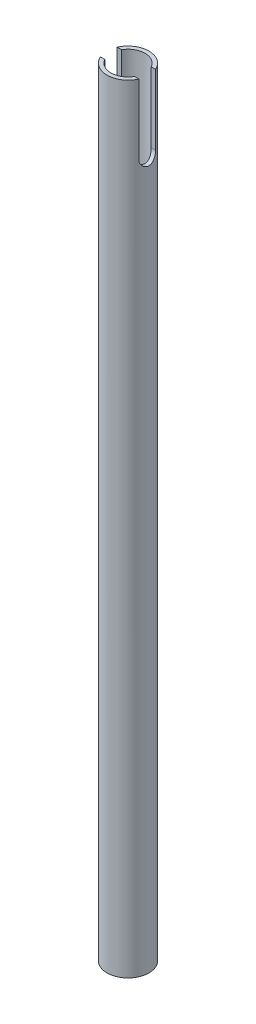
ISO-10303-21;
HEADER;
FILE_DESCRIPTION(('STEP AP214'),'2;1');
FILE_NAME('part.step','',(''),(''),'','','');
FILE_SCHEMA(('AUTOMOTIVE_DESIGN { 1 0 10303 214 1 1 1 1 }'));
ENDSEC;
DATA;
#1=APPLICATION_CONTEXT('core data for automotive mechanical design processes');
#2=APPLICATION_PROTOCOL_DEFINITION('international standard','automotive_design',2000,#1);
#3=PRODUCT_CONTEXT('',#1,'mechanical');
#4=PRODUCT('Part','Part','',(#3));
#5=PRODUCT_RELATED_PRODUCT_CATEGORY('part','',(#4));
#6=PRODUCT_DEFINITION_FORMATION('','',#4);
#7=PRODUCT_DEFINITION_CONTEXT('part definition',#1,'design');
#8=PRODUCT_DEFINITION('design','',#6,#7);
#9=PRODUCT_DEFINITION_SHAPE('','',#8);
#10=(LENGTH_UNIT() NAMED_UNIT(*) SI_UNIT(.MILLI.,.METRE.));
#11=(NAMED_UNIT(*) PLANE_ANGLE_UNIT() SI_UNIT($,.RADIAN.));
#12=(NAMED_UNIT(*) SI_UNIT($,.STERADIAN.) SOLID_ANGLE_UNIT());
#13=UNCERTAINTY_MEASURE_WITH_UNIT(LENGTH_MEASURE(1.E-05),#10,'distance_accuracy_value','');
#14=(GEOMETRIC_REPRESENTATION_CONTEXT(3) GLOBAL_UNCERTAINTY_ASSIGNED_CONTEXT((#13)) GLOBAL_UNIT_ASSIGNED_CONTEXT((#10,
#11,#12)) REPRESENTATION_CONTEXT('',''));
#15=CARTESIAN_POINT('',(0.,0.,0.));
#16=DIRECTION('',(0.,0.,1.));
#17=DIRECTION('',(1.,0.,0.));
#18=AXIS2_PLACEMENT_3D('',#15,#16,#17);
#19=CARTESIAN_POINT('',(-2.69334433135912E-13,294.838886827507,3.17500000000102));
#20=DIRECTION('',(0.,1.,0.));
#21=DIRECTION('',(-1.,0.,0.));
#22=AXIS2_PLACEMENT_3D('',#19,#20,#21);
#23=PLANE('',#22);
#24=DIRECTION('',(-1.,0.,0.));
#25=VECTOR('',#24,1.);
#26=CARTESIAN_POINT('',(-2.69334433135912E-13,294.838886827507,-3.17500000000002));
#27=LINE('',#26,#25);
#28=CARTESIAN_POINT('',(7.27483891574239,294.838886827507,-3.17500000000002));
#29=VERTEX_POINT('',#28);
#30=CARTESIAN_POINT('',(5.63085690548072,294.838886827507,-3.17500000000002));
#31=VERTEX_POINT('',#30);
#32=EDGE_CURVE('E172',#29,#31,#27,.T.);
#33=ORIENTED_EDGE('',*,*,#32,.F.);
#34=CARTESIAN_POINT('',(0.,294.838886827507,0.));
#35=DIRECTION('',(0.,1.,0.));
#36=DIRECTION('',(0.,0.,1.));
#37=AXIS2_PLACEMENT_3D('',#34,#35,#36);
#38=CIRCLE('',#37,7.9375);
#39=CARTESIAN_POINT('',(-7.27483891574239,294.838886827507,-3.17500000000002));
#40=VERTEX_POINT('',#39);
#41=EDGE_CURVE('E206',#29,#40,#38,.T.);
#42=ORIENTED_EDGE('',*,*,#41,.T.);
#43=CARTESIAN_POINT('',(-5.63085690548072,294.838886827507,-3.17500000000002));
#44=VERTEX_POINT('',#43);
#45=EDGE_CURVE('E173',#44,#40,#27,.T.);
#46=ORIENTED_EDGE('',*,*,#45,.F.);
#47=CARTESIAN_POINT('',(0.,294.838886827507,0.));
#48=DIRECTION('',(0.,1.,0.));
#49=DIRECTION('',(0.,0.,1.));
#50=AXIS2_PLACEMENT_3D('',#47,#48,#49);
#51=CIRCLE('',#50,6.4643);
#52=EDGE_CURVE('E209',#31,#44,#51,.T.);
#53=ORIENTED_EDGE('',*,*,#52,.F.);
#54=EDGE_LOOP('',(#33,#42,#46,#53));
#55=FACE_BOUND('',#54,.T.);
#56=ADVANCED_FACE('F38',(#55),#23,.T.);
#57=CARTESIAN_POINT('',(0.,342.689527130179,0.));
#58=DIRECTION('',(0.,-1.,0.));
#59=DIRECTION('',(0.,0.,-1.));
#60=AXIS2_PLACEMENT_3D('',#57,#58,#59);
#61=CYLINDRICAL_SURFACE('',#60,7.9375);
#62=CARTESIAN_POINT('',(0.,0.,0.));
#63=DIRECTION('',(0.,1.,0.));
#64=DIRECTION('',(0.,0.,1.));
#65=AXIS2_PLACEMENT_3D('',#62,#63,#64);
#66=CIRCLE('',#65,7.9375);
#67=CARTESIAN_POINT('',(0.,0.,7.9375));
#68=VERTEX_POINT('',#67);
#69=EDGE_CURVE('E210',#68,#68,#66,.T.);
#70=ORIENTED_EDGE('',*,*,#69,.T.);
#71=EDGE_LOOP('',(#70));
#72=FACE_BOUND('',#71,.T.);
#73=ORIENTED_EDGE('',*,*,#41,.F.);
#74=DIRECTION('',(0.,-1.,0.));
#75=VECTOR('',#74,1.);
#76=CARTESIAN_POINT('',(7.27483891574239,342.689527130179,-3.175));
#77=LINE('',#76,#75);
#78=CARTESIAN_POINT('',(7.27483891574238,268.283660055013,-3.17500000000003));
#79=VERTEX_POINT('',#78);
#80=EDGE_CURVE('E121',#29,#79,#77,.T.);
#81=ORIENTED_EDGE('',*,*,#80,.T.);
#82=CARTESIAN_POINT('',(7.27483891574239,268.283660055013,-3.17500000000002));
#83=CARTESIAN_POINT('',(7.2748213734673,268.198243264165,-3.17501266882703));
#84=CARTESIAN_POINT('',(7.27634285897749,268.11283606094,-3.17155340043566));
#85=CARTESIAN_POINT('',(7.28233280350349,267.942710619034,-3.15779000732848));
#86=CARTESIAN_POINT('',(7.28680014012065,267.857992130385,-3.1474884895671));
#87=CARTESIAN_POINT('',(7.29852780386515,267.690178225788,-3.12019320836238));
#88=CARTESIAN_POINT('',(7.30577708764083,267.607077740343,-3.10322589952439));
#89=CARTESIAN_POINT('',(7.32282084608482,267.442760079916,-3.06278962927676));
#90=CARTESIAN_POINT('',(7.3326154761132,267.361543020223,-3.03932027099636));
#91=CARTESIAN_POINT('',(7.36535374856867,267.121711892214,-2.95952817722214));
#92=CARTESIAN_POINT('',(7.39167700537415,266.966583963794,-2.89376627017735));
#93=CARTESIAN_POINT('',(7.45033388590046,266.66949707163,-2.7392025415261));
#94=CARTESIAN_POINT('',(7.48267321509131,266.527550802181,-2.65037881684983));
#95=CARTESIAN_POINT('',(7.55175336550834,266.252831000298,-2.44684289232141));
#96=CARTESIAN_POINT('',(7.588634899463,266.120902098173,-2.3310360096301));
#97=CARTESIAN_POINT('',(7.66147804996073,265.877739872857,-2.07914313305182));
#98=CARTESIAN_POINT('',(7.69743947634238,265.766510798434,-1.94305298619929));
#99=CARTESIAN_POINT('',(7.76610424655586,265.56362740431,-1.6478343790749));
#100=CARTESIAN_POINT('',(7.79862271461642,265.472920170623,-1.48800809365193));
#101=CARTESIAN_POINT('',(7.85501261299655,265.320045089307,-1.15383332747065));
#102=CARTESIAN_POINT('',(7.8788876513092,265.257865330661,-0.979490943577514));
#103=CARTESIAN_POINT('',(7.91429574508624,265.166855899045,-0.630185812820646));
#104=CARTESIAN_POINT('',(7.92637039529115,265.136557274511,-0.455661798193268));
#105=CARTESIAN_POINT('',(7.93877492459936,265.10543983904,-0.103613634211568));
#106=CARTESIAN_POINT('',(7.93910896442721,265.104610584527,0.0739094300030535));
#107=CARTESIAN_POINT('',(7.92832361516669,265.131651576453,0.416295487790174));
#108=CARTESIAN_POINT('',(7.91784651916131,265.157912368482,0.581309494992117));
#109=CARTESIAN_POINT('',(7.88748217026596,265.235649568583,0.90435871255695));
#110=CARTESIAN_POINT('',(7.86759438481231,265.287127403726,1.06239352740442));
#111=CARTESIAN_POINT('',(7.81997467816328,265.414470371741,1.36984988491621));
#112=CARTESIAN_POINT('',(7.7921290207194,265.490691461876,1.51910565802054));
#113=CARTESIAN_POINT('',(7.7313568354174,265.665021852072,1.80309420082014));
#114=CARTESIAN_POINT('',(7.69842852631223,265.763138831079,1.9378218508183));
#115=CARTESIAN_POINT('',(7.62828318752465,265.985985625325,2.19831250886752));
#116=CARTESIAN_POINT('',(7.59092651959626,266.1120387678,2.32290812422052));
#117=CARTESIAN_POINT('',(7.51779639956165,266.383379666392,2.54968017957911));
#118=CARTESIAN_POINT('',(7.48202367463434,266.528676137309,2.6518464058569));
#119=CARTESIAN_POINT('',(7.41514238501918,266.839825077047,2.83359604410577));
#120=CARTESIAN_POINT('',(7.38419755733311,267.006148568512,2.9124454400729));
#121=CARTESIAN_POINT('',(7.34535742834898,267.264689441899,3.00845526999255));
#122=CARTESIAN_POINT('',(7.33367552004289,267.352356250122,3.03674359852998));
#123=CARTESIAN_POINT('',(7.31322917691504,267.530121964836,3.08565852812916));
#124=CARTESIAN_POINT('',(7.30446343423192,267.620219761407,3.10628856431505));
#125=CARTESIAN_POINT('',(7.28994070197193,267.805384213444,3.14023004946565));
#126=CARTESIAN_POINT('',(7.2843027635288,267.900513238969,3.15325280299648));
#127=CARTESIAN_POINT('',(7.27673901487912,268.09164381356,3.17064531592314));
#128=CARTESIAN_POINT('',(7.2748109173123,268.1876447883,3.17502040721544));
#129=CARTESIAN_POINT('',(7.2748389157424,268.283660055013,3.175));
#130=B_SPLINE_CURVE_WITH_KNOTS('',3,(#82,#83,#84,#85,#86,#87,#88,#89,#90,#91,#92,#93,#94,#95,
#96,#97,#98,#99,#100,#101,#102,#103,#104,#105,#106,#107,#108,#109,#110,#111,#112,#113,#114,#115,
#116,#117,#118,#119,#120,#121,#122,#123,#124,#125,#126,#127,#128,#129),.UNSPECIFIED.,.F.,.F.,(4,
2,2,2,2,2,2,2,2,2,2,2,2,2,2,2,2,2,2,2,2,2,2,4),(0.,0.256150829294331,0.512204118914609,
0.767251309112382,1.02231407025902,1.53143426526081,2.04103977971416,2.57679901192851,
3.11266809105967,3.66971038544649,4.22651988700747,4.75637028950527,5.28603291779514,
5.7859440297451,6.28588343572725,6.79335980872479,7.30101443548666,7.84196226045962,
8.38315590960402,8.93991483457341,9.21815697205887,9.49627415290113,9.78435582473148,
10.072259818324),.UNSPECIFIED.);
#131=CARTESIAN_POINT('',(7.27483891574239,268.283660055013,3.175));
#132=VERTEX_POINT('',#131);
#133=EDGE_CURVE('E120',#79,#132,#130,.T.);
#134=ORIENTED_EDGE('',*,*,#133,.T.);
#135=DIRECTION('',(0.,-1.,0.));
#136=VECTOR('',#135,1.);
#137=CARTESIAN_POINT('',(7.27483891574239,342.689527130179,3.17500000000001));
#138=LINE('',#137,#136);
#139=CARTESIAN_POINT('',(7.27483891574195,294.838886827507,3.17500000000102));
#140=VERTEX_POINT('',#139);
#141=EDGE_CURVE('E138',#132,#140,#138,.F.);
#142=ORIENTED_EDGE('',*,*,#141,.T.);
#143=CARTESIAN_POINT('',(-7.27483891574195,294.838886827507,3.17500000000102));
#144=VERTEX_POINT('',#143);
#145=EDGE_CURVE('E133',#144,#140,#38,.T.);
#146=ORIENTED_EDGE('',*,*,#145,.F.);
#147=DIRECTION('',(0.,-1.,0.));
#148=VECTOR('',#147,1.);
#149=CARTESIAN_POINT('',(-7.27483891574239,342.689527130179,3.17500000000001));
#150=LINE('',#149,#148);
#151=CARTESIAN_POINT('',(-7.27483891574239,268.283660055013,3.175));
#152=VERTEX_POINT('',#151);
#153=EDGE_CURVE('E60',#144,#152,#150,.T.);
#154=ORIENTED_EDGE('',*,*,#153,.T.);
#155=CARTESIAN_POINT('',(-7.2748389157424,268.283660055013,3.175));
#156=CARTESIAN_POINT('',(-7.27482137346731,268.198243264165,3.17501266882701));
#157=CARTESIAN_POINT('',(-7.2763428589775,268.11283606094,3.17155340043565));
#158=CARTESIAN_POINT('',(-7.2823328035035,267.942710619034,3.15779000732847));
#159=CARTESIAN_POINT('',(-7.28680014012065,267.857992130385,3.14748848956708));
#160=CARTESIAN_POINT('',(-7.29852780386515,267.690178225788,3.12019320836236));
#161=CARTESIAN_POINT('',(-7.30577708764083,267.607077740343,3.10322589952438));
#162=CARTESIAN_POINT('',(-7.32282084608483,267.442760079916,3.06278962927674));
#163=CARTESIAN_POINT('',(-7.3326154761132,267.361543020223,3.03932027099634));
#164=CARTESIAN_POINT('',(-7.36535374856868,267.121711892214,2.95952817722212));
#165=CARTESIAN_POINT('',(-7.39167700537416,266.966583963794,2.89376627017733));
#166=CARTESIAN_POINT('',(-7.45033388590046,266.66949707163,2.73920254152609));
#167=CARTESIAN_POINT('',(-7.48267321509131,266.527550802181,2.65037881684981));
#168=CARTESIAN_POINT('',(-7.55175336550835,266.252831000298,2.4468428923214));
#169=CARTESIAN_POINT('',(-7.588634899463,266.120902098173,2.33103600963009));
#170=CARTESIAN_POINT('',(-7.66147804996073,265.877739872857,2.07914313305181));
#171=CARTESIAN_POINT('',(-7.69743947634239,265.766510798434,1.94305298619927));
#172=CARTESIAN_POINT('',(-7.76610424655586,265.56362740431,1.64783437907488));
#173=CARTESIAN_POINT('',(-7.79862271461643,265.472920170623,1.48800809365192));
#174=CARTESIAN_POINT('',(-7.85501261299655,265.320045089307,1.15383332747063));
#175=CARTESIAN_POINT('',(-7.87888765130921,265.257865330661,0.979490943577496));
#176=CARTESIAN_POINT('',(-7.91429574508624,265.166855899045,0.630185812820627));
#177=CARTESIAN_POINT('',(-7.92637039529115,265.136557274511,0.455661798193249));
#178=CARTESIAN_POINT('',(-7.93877492459936,265.10543983904,0.103613634211549));
#179=CARTESIAN_POINT('',(-7.93910896442721,265.104610584527,-0.0739094300030727));
#180=CARTESIAN_POINT('',(-7.92832361516669,265.131651576453,-0.416295487790193));
#181=CARTESIAN_POINT('',(-7.91784651916131,265.157912368482,-0.581309494992136));
#182=CARTESIAN_POINT('',(-7.88748217026596,265.235649568583,-0.904358712556969));
#183=CARTESIAN_POINT('',(-7.86759438481231,265.287127403726,-1.06239352740444));
#184=CARTESIAN_POINT('',(-7.81997467816327,265.414470371741,-1.36984988491622));
#185=CARTESIAN_POINT('',(-7.79212902071939,265.490691461876,-1.51910565802056));
#186=CARTESIAN_POINT('',(-7.73135683541739,265.665021852072,-1.80309420082016));
#187=CARTESIAN_POINT('',(-7.69842852631223,265.763138831079,-1.93782185081832));
#188=CARTESIAN_POINT('',(-7.62828318752464,265.985985625325,-2.19831250886754));
#189=CARTESIAN_POINT('',(-7.59092651959626,266.1120387678,-2.32290812422054));
#190=CARTESIAN_POINT('',(-7.51779639956165,266.383379666392,-2.54968017957913));
#191=CARTESIAN_POINT('',(-7.48202367463433,266.528676137309,-2.65184640585692));
#192=CARTESIAN_POINT('',(-7.41514238501917,266.839825077047,-2.83359604410579));
#193=CARTESIAN_POINT('',(-7.3841975573331,267.006148568512,-2.91244544007292));
#194=CARTESIAN_POINT('',(-7.34535742834897,267.264689441899,-3.00845526999257));
#195=CARTESIAN_POINT('',(-7.33367552004289,267.352356250122,-3.03674359853));
#196=CARTESIAN_POINT('',(-7.31322917691503,267.530121964836,-3.08565852812917));
#197=CARTESIAN_POINT('',(-7.30446343423191,267.620219761407,-3.10628856431507));
#198=CARTESIAN_POINT('',(-7.28994070197192,267.805384213444,-3.14023004946566));
#199=CARTESIAN_POINT('',(-7.28430276352879,267.900513238969,-3.15325280299649));
#200=CARTESIAN_POINT('',(-7.27673901487911,268.09164381356,-3.17064531592316));
#201=CARTESIAN_POINT('',(-7.27481091731229,268.1876447883,-3.17502040721546));
#202=CARTESIAN_POINT('',(-7.27483891574239,268.283660055013,-3.17500000000002));
#203=B_SPLINE_CURVE_WITH_KNOTS('',3,(#155,#156,#157,#158,#159,#160,#161,#162,#163,#164,#165,
#166,#167,#168,#169,#170,#171,#172,#173,#174,#175,#176,#177,#178,#179,#180,#181,#182,#183,#184,
#185,#186,#187,#188,#189,#190,#191,#192,#193,#194,#195,#196,#197,#198,#199,#200,#201,#202),
.UNSPECIFIED.,.F.,.F.,(4,2,2,2,2,2,2,2,2,2,2,2,2,2,2,2,2,2,2,2,2,2,2,4),(0.,0.256150829294331,
0.512204118914608,0.767251309112382,1.02231407025902,1.53143426526081,2.04103977971416,
2.57679901192851,3.11266809105967,3.66971038544649,4.22651988700747,4.75637028950527,
5.28603291779514,5.7859440297451,6.28588343572725,6.79335980872479,7.30101443548666,
7.84196226045962,8.38315590960402,8.93991483457341,9.21815697205887,9.49627415290113,
9.78435582473148,10.072259818324),.UNSPECIFIED.);
#204=CARTESIAN_POINT('',(-7.27483891574238,268.283660055013,-3.17500000000003));
#205=VERTEX_POINT('',#204);
#206=EDGE_CURVE('E111',#152,#205,#203,.T.);
#207=ORIENTED_EDGE('',*,*,#206,.T.);
#208=DIRECTION('',(0.,-1.,0.));
#209=VECTOR('',#208,1.);
#210=CARTESIAN_POINT('',(-7.27483891574239,342.689527130179,-3.175));
#211=LINE('',#210,#209);
#212=EDGE_CURVE('E136',#205,#40,#211,.F.);
#213=ORIENTED_EDGE('',*,*,#212,.T.);
#214=EDGE_LOOP('',(#73,#81,#134,#142,#146,#154,#207,#213));
#215=FACE_BOUND('',#214,.T.);
#216=ADVANCED_FACE('F40',(#72,#215),#61,.T.);
#217=CARTESIAN_POINT('',(0.,0.,0.));
#218=DIRECTION('',(0.,1.,0.));
#219=DIRECTION('',(0.,0.,1.));
#220=AXIS2_PLACEMENT_3D('',#217,#218,#219);
#221=PLANE('',#220);
#222=ORIENTED_EDGE('',*,*,#69,.F.);
#223=EDGE_LOOP('',(#222));
#224=FACE_BOUND('',#223,.T.);
#225=CARTESIAN_POINT('',(0.,0.,0.));
#226=DIRECTION('',(0.,1.,0.));
#227=DIRECTION('',(0.,0.,1.));
#228=AXIS2_PLACEMENT_3D('',#225,#226,#227);
#229=CIRCLE('',#228,6.4643);
#230=CARTESIAN_POINT('',(0.,0.,6.4643));
#231=VERTEX_POINT('',#230);
#232=EDGE_CURVE('E214',#231,#231,#229,.T.);
#233=ORIENTED_EDGE('',*,*,#232,.T.);
#234=EDGE_LOOP('',(#233));
#235=FACE_BOUND('',#234,.T.);
#236=ADVANCED_FACE('F179',(#224,#235),#221,.F.);
#237=CARTESIAN_POINT('',(0.,342.689527130179,0.));
#238=DIRECTION('',(0.,-1.,0.));
#239=DIRECTION('',(0.,0.,-1.));
#240=AXIS2_PLACEMENT_3D('',#237,#238,#239);
#241=CYLINDRICAL_SURFACE('',#240,6.4643);
#242=DIRECTION('',(0.,-1.,0.));
#243=VECTOR('',#242,1.);
#244=CARTESIAN_POINT('',(-5.63085690548073,342.689527130179,-3.175));
#245=LINE('',#244,#243);
#246=CARTESIAN_POINT('',(-5.63085690548071,268.283660055013,-3.17500000000003));
#247=VERTEX_POINT('',#246);
#248=EDGE_CURVE('E134',#247,#44,#245,.F.);
#249=ORIENTED_EDGE('',*,*,#248,.F.);
#250=CARTESIAN_POINT('',(-5.63085690548073,268.283660055013,3.175));
#251=CARTESIAN_POINT('',(-5.63083314427865,268.200286710382,3.17501475658537));
#252=CARTESIAN_POINT('',(-5.63270800290612,268.11692652629,3.17171650894932));
#253=CARTESIAN_POINT('',(-5.64007619078876,267.95092826617,3.15861005673362));
#254=CARTESIAN_POINT('',(-5.64556738634361,267.868289793435,3.14880569084843));
#255=CARTESIAN_POINT('',(-5.65994981136478,267.704786304415,3.12287502503968));
#256=CARTESIAN_POINT('',(-5.66882198481542,267.623913986792,3.10678414485082));
#257=CARTESIAN_POINT('',(-5.68964152520503,267.464049730009,3.06848950606602));
#258=CARTESIAN_POINT('',(-5.70158922758274,267.385057996985,3.0462850806656));
#259=CARTESIAN_POINT('',(-5.74141923049072,267.151993198754,2.97094683956398));
#260=CARTESIAN_POINT('',(-5.77333408209964,267.001353569371,2.9090108202004));
#261=CARTESIAN_POINT('',(-5.84425924105452,266.712499000312,2.76375069900003));
#262=CARTESIAN_POINT('',(-5.8832801090714,266.574303016919,2.68039468681891));
#263=CARTESIAN_POINT('',(-5.96775511660967,266.302362239444,2.48697633404427));
#264=CARTESIAN_POINT('',(-6.01347388807209,266.16982520491,2.37532770540394));
#265=CARTESIAN_POINT('',(-6.10404750316968,265.924450447699,2.13181920715588));
#266=CARTESIAN_POINT('',(-6.14890211569321,265.8116179315,1.99995401300489));
#267=CARTESIAN_POINT('',(-6.23617179606459,265.601684855218,1.70932187954948));
#268=CARTESIAN_POINT('',(-6.27824209999685,265.506071388216,1.54936740140355));
#269=CARTESIAN_POINT('',(-6.35176072116116,265.343664156158,1.21319061658811));
#270=CARTESIAN_POINT('',(-6.38321544776104,265.276852994348,1.03697820811136));
#271=CARTESIAN_POINT('',(-6.43004158193837,265.178726948965,0.686188092188344));
#272=CARTESIAN_POINT('',(-6.4463738522475,265.145278964049,0.512338218857001));
#273=CARTESIAN_POINT('',(-6.46469144763397,265.107818375536,0.160782019690497));
#274=CARTESIAN_POINT('',(-6.46668486855406,265.103789161817,-0.0169220731568769));
#275=CARTESIAN_POINT('',(-6.45656772214049,265.124424959705,-0.355165464690641));
#276=CARTESIAN_POINT('',(-6.44562758639317,265.14670857049,-0.515892945153662));
#277=CARTESIAN_POINT('',(-6.41262380355029,265.21509537683,-0.830980900255626));
#278=CARTESIAN_POINT('',(-6.39055953953696,265.261199893438,-0.985341021262245));
#279=CARTESIAN_POINT('',(-6.33694807701977,265.376259136466,-1.28605792480315));
#280=CARTESIAN_POINT('',(-6.30527071175889,265.4455289375,-1.4322699933214));
#281=CARTESIAN_POINT('',(-6.23531544865734,265.604536123304,-1.71135796541494));
#282=CARTESIAN_POINT('',(-6.19703506227319,265.694281228927,-1.84422881097801));
#283=CARTESIAN_POINT('',(-6.11334024943196,265.901197126011,-2.10589815284401));
#284=CARTESIAN_POINT('',(-6.06759349912715,266.020131162232,-2.23319819913489));
#285=CARTESIAN_POINT('',(-5.97642079952693,266.277284673666,-2.4668462243058));
#286=CARTESIAN_POINT('',(-5.93099515323758,266.415520324906,-2.57317644688654));
#287=CARTESIAN_POINT('',(-5.84266284464015,266.717723152423,-2.76814528378425));
#288=CARTESIAN_POINT('',(-5.80007313328348,266.882739171476,-2.85533090866607));
#289=CARTESIAN_POINT('',(-5.74498523796175,267.141115989921,-2.96377401450741));
#290=CARTESIAN_POINT('',(-5.72809486991882,267.22900447788,-2.99618869442099));
#291=CARTESIAN_POINT('',(-5.6978812208207,267.407841164464,-3.05325494421093));
#292=CARTESIAN_POINT('',(-5.68455638707003,267.498788011769,-3.07790989407048));
#293=CARTESIAN_POINT('',(-5.65951648210792,267.703905447753,-3.12376274190013));
#294=CARTESIAN_POINT('',(-5.64884707083826,267.818676413049,-3.14291763203009));
#295=CARTESIAN_POINT('',(-5.63809564796982,267.99222951956,-3.1621351306962));
#296=CARTESIAN_POINT('',(-5.63538722073202,268.050369392927,-3.16695519983113));
#297=CARTESIAN_POINT('',(-5.63176603795251,268.166887024159,-3.1733882775212));
#298=CARTESIAN_POINT('',(-5.6308534434139,268.225264802883,-3.17500099852575));
#299=CARTESIAN_POINT('',(-5.63085690548072,268.283660055013,-3.17500000000002));
#300=B_SPLINE_CURVE_WITH_KNOTS('',3,(#250,#251,#252,#253,#254,#255,#256,#257,#258,#259,#260,
#261,#262,#263,#264,#265,#266,#267,#268,#269,#270,#271,#272,#273,#274,#275,#276,#277,#278,#279,
#280,#281,#282,#283,#284,#285,#286,#287,#288,#289,#290,#291,#292,#293,#294,#295,#296,#297,#298,
#299),.UNSPECIFIED.,.F.,.F.,(4,2,2,2,2,2,2,2,2,2,2,2,2,2,2,2,2,2,2,2,2,2,2,2,4),(0.,
0.250012145988229,0.499876912554615,0.74835372511285,0.996857649784888,1.4924278441344,
1.98874063593385,2.52414179614758,3.05968421079775,3.62982161542685,4.19961416973237,
4.73004882970633,5.26018397799675,5.74579693142526,6.23143681875925,6.72397049630929,
7.21669020692482,7.75472587709897,8.2932151937208,8.86416763704416,9.14936329782662,
9.43443456060703,9.78397951274087,9.95908597830925,10.1342081421097),.UNSPECIFIED.);
#301=CARTESIAN_POINT('',(-5.63085690548072,268.283660055013,3.175));
#302=VERTEX_POINT('',#301);
#303=EDGE_CURVE('E12',#302,#247,#300,.T.);
#304=ORIENTED_EDGE('',*,*,#303,.F.);
#305=DIRECTION('',(0.,-1.,0.));
#306=VECTOR('',#305,1.);
#307=CARTESIAN_POINT('',(-5.63085690548072,342.689527130179,3.17500000000001));
#308=LINE('',#307,#306);
#309=CARTESIAN_POINT('',(-5.63085690548015,294.838886827507,3.17500000000102));
#310=VERTEX_POINT('',#309);
#311=EDGE_CURVE('E125',#310,#302,#308,.T.);
#312=ORIENTED_EDGE('',*,*,#311,.F.);
#313=CARTESIAN_POINT('',(5.63085690548015,294.838886827507,3.17500000000102));
#314=VERTEX_POINT('',#313);
#315=EDGE_CURVE('E204',#310,#314,#51,.T.);
#316=ORIENTED_EDGE('',*,*,#315,.T.);
#317=DIRECTION('',(0.,-1.,0.));
#318=VECTOR('',#317,1.);
#319=CARTESIAN_POINT('',(5.63085690548072,342.689527130179,3.17500000000001));
#320=LINE('',#319,#318);
#321=CARTESIAN_POINT('',(5.63085690548072,268.283660055013,3.175));
#322=VERTEX_POINT('',#321);
#323=EDGE_CURVE('E68',#322,#314,#320,.F.);
#324=ORIENTED_EDGE('',*,*,#323,.F.);
#325=CARTESIAN_POINT('',(5.63085690548072,268.283660055013,-3.17500000000002));
#326=CARTESIAN_POINT('',(5.63083314427864,268.200286710382,-3.17501475658539));
#327=CARTESIAN_POINT('',(5.63270800290611,268.11692652629,-3.17171650894934));
#328=CARTESIAN_POINT('',(5.64007619078875,267.95092826617,-3.15861005673364));
#329=CARTESIAN_POINT('',(5.6455673863436,267.868289793435,-3.14880569084844));
#330=CARTESIAN_POINT('',(5.65994981136478,267.704786304415,-3.1228750250397));
#331=CARTESIAN_POINT('',(5.66882198481541,267.623913986792,-3.10678414485084));
#332=CARTESIAN_POINT('',(5.68964152520502,267.464049730009,-3.06848950606604));
#333=CARTESIAN_POINT('',(5.70158922758273,267.385057996985,-3.04628508066561));
#334=CARTESIAN_POINT('',(5.74141923049071,267.151993198754,-2.970946839564));
#335=CARTESIAN_POINT('',(5.77333408209963,267.001353569371,-2.90901082020042));
#336=CARTESIAN_POINT('',(5.84425924105451,266.712499000312,-2.76375069900005));
#337=CARTESIAN_POINT('',(5.88328010907139,266.574303016919,-2.68039468681893));
#338=CARTESIAN_POINT('',(5.96775511660966,266.302362239444,-2.48697633404429));
#339=CARTESIAN_POINT('',(6.01347388807209,266.16982520491,-2.37532770540395));
#340=CARTESIAN_POINT('',(6.10404750316967,265.924450447699,-2.13181920715591));
#341=CARTESIAN_POINT('',(6.1489021156932,265.8116179315,-1.99995401300494));
#342=CARTESIAN_POINT('',(6.23617179606457,265.601684855218,-1.70932187954955));
#343=CARTESIAN_POINT('',(6.27824209999683,265.506071388216,-1.54936740140363));
#344=CARTESIAN_POINT('',(6.35176072116115,265.343664156158,-1.21319061658817));
#345=CARTESIAN_POINT('',(6.38321544776103,265.276852994348,-1.0369782081114));
#346=CARTESIAN_POINT('',(6.43004158193837,265.178726948965,-0.68618809218836));
#347=CARTESIAN_POINT('',(6.4463738522475,265.145278964049,-0.512338218857017));
#348=CARTESIAN_POINT('',(6.46469144763397,265.107818375536,-0.16078201969051));
#349=CARTESIAN_POINT('',(6.46668486855406,265.103789161817,0.0169220731568666));
#350=CARTESIAN_POINT('',(6.45656772214049,265.124424959705,0.355165464690633));
#351=CARTESIAN_POINT('',(6.44562758639317,265.14670857049,0.515892945153654));
#352=CARTESIAN_POINT('',(6.41262380355029,265.21509537683,0.830980900255617));
#353=CARTESIAN_POINT('',(6.39055953953696,265.261199893438,0.985341021262237));
#354=CARTESIAN_POINT('',(6.33694807701977,265.376259136466,1.28605792480314));
#355=CARTESIAN_POINT('',(6.30527071175889,265.4455289375,1.43226999332139));
#356=CARTESIAN_POINT('',(6.23531544865734,265.604536123304,1.71135796541493));
#357=CARTESIAN_POINT('',(6.19703506227319,265.694281228927,1.844228810978));
#358=CARTESIAN_POINT('',(6.11334024943196,265.901197126011,2.10589815284401));
#359=CARTESIAN_POINT('',(6.06759349912715,266.020131162232,2.23319819913489));
#360=CARTESIAN_POINT('',(5.97642079952693,266.277284673666,2.46684622430579));
#361=CARTESIAN_POINT('',(5.93099515323759,266.415520324906,2.57317644688652));
#362=CARTESIAN_POINT('',(5.84266284464016,266.717723152423,2.76814528378423));
#363=CARTESIAN_POINT('',(5.80007313328349,266.882739171476,2.85533090866605));
#364=CARTESIAN_POINT('',(5.74498523796176,267.141115989921,2.96377401450739));
#365=CARTESIAN_POINT('',(5.72809486991883,267.22900447788,2.99618869442096));
#366=CARTESIAN_POINT('',(5.69788122082071,267.407841164464,3.0532549442109));
#367=CARTESIAN_POINT('',(5.68455638707004,267.498788011769,3.07790989407046));
#368=CARTESIAN_POINT('',(5.65951648210793,267.703905447753,3.12376274190011));
#369=CARTESIAN_POINT('',(5.64884707083827,267.818676413049,3.14291763203007));
#370=CARTESIAN_POINT('',(5.63809564796983,267.99222951956,3.16213513069618));
#371=CARTESIAN_POINT('',(5.63538722073203,268.050369392927,3.16695519983111));
#372=CARTESIAN_POINT('',(5.63176603795252,268.166887024159,3.17338827752118));
#373=CARTESIAN_POINT('',(5.63085344341391,268.225264802883,3.17500099852574));
#374=CARTESIAN_POINT('',(5.63085690548073,268.283660055013,3.175));
#375=B_SPLINE_CURVE_WITH_KNOTS('',3,(#325,#326,#327,#328,#329,#330,#331,#332,#333,#334,#335,
#336,#337,#338,#339,#340,#341,#342,#343,#344,#345,#346,#347,#348,#349,#350,#351,#352,#353,#354,
#355,#356,#357,#358,#359,#360,#361,#362,#363,#364,#365,#366,#367,#368,#369,#370,#371,#372,#373,
#374),.UNSPECIFIED.,.F.,.F.,(4,2,2,2,2,2,2,2,2,2,2,2,2,2,2,2,2,2,2,2,2,2,2,2,4),(0.,
0.250012145988229,0.499876912554615,0.74835372511285,0.996857649784888,1.4924278441344,
1.98874063593385,2.52414179614754,3.05968421079767,3.6298216154268,4.19961416973237,
4.73004882970633,5.26018397799675,5.74579693142527,6.23143681875926,6.7239704963093,
7.21669020692483,7.75472587709898,8.29321519372081,8.86416763704417,9.14936329782656,
9.43443456060704,9.78397951274087,9.95908597830926,10.1342081421097),.UNSPECIFIED.);
#376=CARTESIAN_POINT('',(5.63085690548071,268.283660055013,-3.17500000000003));
#377=VERTEX_POINT('',#376);
#378=EDGE_CURVE('E53',#377,#322,#375,.T.);
#379=ORIENTED_EDGE('',*,*,#378,.F.);
#380=DIRECTION('',(0.,-1.,0.));
#381=VECTOR('',#380,1.);
#382=CARTESIAN_POINT('',(5.63085690548073,342.689527130179,-3.175));
#383=LINE('',#382,#381);
#384=EDGE_CURVE('E143',#31,#377,#383,.T.);
#385=ORIENTED_EDGE('',*,*,#384,.F.);
#386=ORIENTED_EDGE('',*,*,#52,.T.);
#387=EDGE_LOOP('',(#249,#304,#312,#316,#324,#379,#385,#386));
#388=FACE_BOUND('',#387,.T.);
#389=ORIENTED_EDGE('',*,*,#232,.F.);
#390=EDGE_LOOP('',(#389));
#391=FACE_BOUND('',#390,.T.);
#392=ADVANCED_FACE('F175',(#388,#391),#241,.F.);
#393=DIRECTION('',(1.,0.,0.));
#394=VECTOR('',#393,1.);
#395=CARTESIAN_POINT('',(-2.69334433135912E-13,294.838886827507,3.17500000000102));
#396=LINE('',#395,#394);
#397=EDGE_CURVE('E202',#144,#310,#396,.T.);
#398=ORIENTED_EDGE('',*,*,#397,.F.);
#399=ORIENTED_EDGE('',*,*,#145,.T.);
#400=EDGE_CURVE('E205',#314,#140,#396,.T.);
#401=ORIENTED_EDGE('',*,*,#400,.F.);
#402=ORIENTED_EDGE('',*,*,#315,.F.);
#403=EDGE_LOOP('',(#398,#399,#401,#402));
#404=FACE_BOUND('',#403,.T.);
#405=ADVANCED_FACE('F178',(#404),#23,.T.);
#406=CARTESIAN_POINT('',(-7.9375,319.083660055013,3.17500000000001));
#407=DIRECTION('',(0.,0.,1.));
#408=DIRECTION('',(0.,-1.,0.));
#409=AXIS2_PLACEMENT_3D('',#406,#407,#408);
#410=PLANE('',#409);
#411=DIRECTION('',(1.,0.,0.));
#412=VECTOR('',#411,1.);
#413=CARTESIAN_POINT('',(-7.9375,268.283660055013,3.175));
#414=LINE('',#413,#412);
#415=EDGE_CURVE('E127',#322,#132,#414,.T.);
#416=ORIENTED_EDGE('',*,*,#415,.F.);
#417=ORIENTED_EDGE('',*,*,#323,.T.);
#418=ORIENTED_EDGE('',*,*,#400,.T.);
#419=ORIENTED_EDGE('',*,*,#141,.F.);
#420=EDGE_LOOP('',(#416,#417,#418,#419));
#421=FACE_BOUND('',#420,.T.);
#422=ADVANCED_FACE('F196',(#421),#410,.F.);
#423=CARTESIAN_POINT('',(-7.9375,319.083660055013,-3.17500000000001));
#424=DIRECTION('',(0.,0.,-1.));
#425=DIRECTION('',(0.,1.,0.));
#426=AXIS2_PLACEMENT_3D('',#423,#424,#425);
#427=PLANE('',#426);
#428=ORIENTED_EDGE('',*,*,#32,.T.);
#429=ORIENTED_EDGE('',*,*,#384,.T.);
#430=DIRECTION('',(1.,0.,0.));
#431=VECTOR('',#430,1.);
#432=CARTESIAN_POINT('',(-7.9375,268.283660055013,-3.17500000000003));
#433=LINE('',#432,#431);
#434=EDGE_CURVE('E126',#377,#79,#433,.T.);
#435=ORIENTED_EDGE('',*,*,#434,.T.);
#436=ORIENTED_EDGE('',*,*,#80,.F.);
#437=EDGE_LOOP('',(#428,#429,#435,#436));
#438=FACE_BOUND('',#437,.T.);
#439=ADVANCED_FACE('F161',(#438),#427,.F.);
#440=CARTESIAN_POINT('',(-7.9375,268.283660055013,0.));
#441=DIRECTION('',(1.,0.,0.));
#442=DIRECTION('',(0.,0.,-1.));
#443=AXIS2_PLACEMENT_3D('',#440,#441,#442);
#444=CYLINDRICAL_SURFACE('',#443,3.17500000000001);
#445=ORIENTED_EDGE('',*,*,#434,.F.);
#446=ORIENTED_EDGE('',*,*,#378,.T.);
#447=ORIENTED_EDGE('',*,*,#415,.T.);
#448=ORIENTED_EDGE('',*,*,#133,.F.);
#449=EDGE_LOOP('',(#445,#446,#447,#448));
#450=FACE_BOUND('',#449,.T.);
#451=ADVANCED_FACE('F156',(#450),#444,.F.);
#452=EDGE_CURVE('E113',#152,#302,#414,.T.);
#453=ORIENTED_EDGE('',*,*,#452,.T.);
#454=ORIENTED_EDGE('',*,*,#303,.T.);
#455=EDGE_CURVE('E116',#205,#247,#433,.T.);
#456=ORIENTED_EDGE('',*,*,#455,.F.);
#457=ORIENTED_EDGE('',*,*,#206,.F.);
#458=EDGE_LOOP('',(#453,#454,#456,#457));
#459=FACE_BOUND('',#458,.T.);
#460=ADVANCED_FACE('F112',(#459),#444,.F.);
#461=ORIENTED_EDGE('',*,*,#455,.T.);
#462=ORIENTED_EDGE('',*,*,#248,.T.);
#463=ORIENTED_EDGE('',*,*,#45,.T.);
#464=ORIENTED_EDGE('',*,*,#212,.F.);
#465=EDGE_LOOP('',(#461,#462,#463,#464));
#466=FACE_BOUND('',#465,.T.);
#467=ADVANCED_FACE('F222',(#466),#427,.F.);
#468=ORIENTED_EDGE('',*,*,#397,.T.);
#469=ORIENTED_EDGE('',*,*,#311,.T.);
#470=ORIENTED_EDGE('',*,*,#452,.F.);
#471=ORIENTED_EDGE('',*,*,#153,.F.);
#472=EDGE_LOOP('',(#468,#469,#470,#471));
#473=FACE_BOUND('',#472,.T.);
#474=ADVANCED_FACE('F123',(#473),#410,.F.);
#475=CLOSED_SHELL('',(#56,#216,#236,#392,#405,#422,#439,#451,#460,#467,#474));
#476=MANIFOLD_SOLID_BREP('B2',#475);
#477=ADVANCED_BREP_SHAPE_REPRESENTATION('',(#18,#476),#14);
#478=SHAPE_DEFINITION_REPRESENTATION(#9,#477);
ENDSEC;
END-ISO-10303-21;
